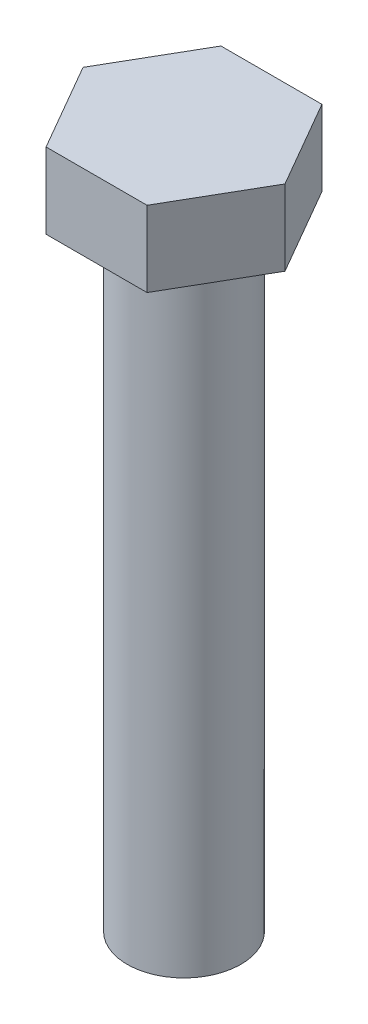
ISO-10303-21;
HEADER;
FILE_DESCRIPTION(('STEP AP214'),'2;1');
FILE_NAME('part.step','',(''),(''),'','','');
FILE_SCHEMA(('AUTOMOTIVE_DESIGN { 1 0 10303 214 1 1 1 1 }'));
ENDSEC;
DATA;
#1=APPLICATION_CONTEXT('core data for automotive mechanical design processes');
#2=APPLICATION_PROTOCOL_DEFINITION('international standard','automotive_design',2000,#1);
#3=PRODUCT_CONTEXT('',#1,'mechanical');
#4=PRODUCT('Part','Part','',(#3));
#5=PRODUCT_RELATED_PRODUCT_CATEGORY('part','',(#4));
#6=PRODUCT_DEFINITION_FORMATION('','',#4);
#7=PRODUCT_DEFINITION_CONTEXT('part definition',#1,'design');
#8=PRODUCT_DEFINITION('design','',#6,#7);
#9=PRODUCT_DEFINITION_SHAPE('','',#8);
#10=(LENGTH_UNIT() NAMED_UNIT(*) SI_UNIT(.MILLI.,.METRE.));
#11=(NAMED_UNIT(*) PLANE_ANGLE_UNIT() SI_UNIT($,.RADIAN.));
#12=(NAMED_UNIT(*) SI_UNIT($,.STERADIAN.) SOLID_ANGLE_UNIT());
#13=UNCERTAINTY_MEASURE_WITH_UNIT(LENGTH_MEASURE(1.E-05),#10,'distance_accuracy_value','');
#14=(GEOMETRIC_REPRESENTATION_CONTEXT(3) GLOBAL_UNCERTAINTY_ASSIGNED_CONTEXT((#13)) GLOBAL_UNIT_ASSIGNED_CONTEXT((#10,
#11,#12)) REPRESENTATION_CONTEXT('',''));
#15=CARTESIAN_POINT('',(0.,0.,0.));
#16=DIRECTION('',(0.,0.,1.));
#17=DIRECTION('',(1.,0.,0.));
#18=AXIS2_PLACEMENT_3D('',#15,#16,#17);
#19=CARTESIAN_POINT('',(4.12077981131412,6.1722,7.13739999999996));
#20=DIRECTION('',(-0.866025403784442,0.,-0.499999999999995));
#21=DIRECTION('',(-0.499999999999995,0.,0.866025403784442));
#22=AXIS2_PLACEMENT_3D('',#19,#20,#21);
#23=PLANE('',#22);
#24=DIRECTION('',(0.499999999999995,0.,-0.866025403784442));
#25=VECTOR('',#24,1.);
#26=CARTESIAN_POINT('',(4.12077981131412,0.,7.13739999999996));
#27=LINE('',#26,#25);
#28=CARTESIAN_POINT('',(4.12077981131412,0.,7.13739999999996));
#29=VERTEX_POINT('',#28);
#30=CARTESIAN_POINT('',(8.24155962262808,0.,0.));
#31=VERTEX_POINT('',#30);
#32=EDGE_CURVE('E123',#29,#31,#27,.T.);
#33=ORIENTED_EDGE('',*,*,#32,.T.);
#34=DIRECTION('',(0.,-1.,0.));
#35=VECTOR('',#34,1.);
#36=CARTESIAN_POINT('',(8.24155962262808,6.1722,0.));
#37=LINE('',#36,#35);
#38=CARTESIAN_POINT('',(8.24155962262808,6.1722,0.));
#39=VERTEX_POINT('',#38);
#40=EDGE_CURVE('E40',#39,#31,#37,.T.);
#41=ORIENTED_EDGE('',*,*,#40,.F.);
#42=DIRECTION('',(0.499999999999995,0.,-0.866025403784442));
#43=VECTOR('',#42,1.);
#44=CARTESIAN_POINT('',(4.12077981131412,6.1722,7.13739999999996));
#45=LINE('',#44,#43);
#46=CARTESIAN_POINT('',(4.12077981131412,6.1722,7.13739999999996));
#47=VERTEX_POINT('',#46);
#48=EDGE_CURVE('E134',#47,#39,#45,.T.);
#49=ORIENTED_EDGE('',*,*,#48,.F.);
#50=DIRECTION('',(0.,-1.,0.));
#51=VECTOR('',#50,1.);
#52=CARTESIAN_POINT('',(4.12077981131412,6.1722,7.13739999999996));
#53=LINE('',#52,#51);
#54=EDGE_CURVE('E119',#47,#29,#53,.T.);
#55=ORIENTED_EDGE('',*,*,#54,.T.);
#56=EDGE_LOOP('',(#33,#41,#49,#55));
#57=FACE_BOUND('',#56,.T.);
#58=ADVANCED_FACE('F37',(#57),#23,.F.);
#59=CARTESIAN_POINT('',(8.24155962262808,6.1722,0.));
#60=DIRECTION('',(-0.866025403784438,0.,0.500000000000001));
#61=DIRECTION('',(0.500000000000001,0.,0.866025403784438));
#62=AXIS2_PLACEMENT_3D('',#59,#60,#61);
#63=PLANE('',#62);
#64=DIRECTION('',(-0.500000000000001,0.,-0.866025403784438));
#65=VECTOR('',#64,1.);
#66=CARTESIAN_POINT('',(8.24155962262808,0.,0.));
#67=LINE('',#66,#65);
#68=CARTESIAN_POINT('',(4.12077981131402,0.,-7.13740000000002));
#69=VERTEX_POINT('',#68);
#70=EDGE_CURVE('E126',#31,#69,#67,.T.);
#71=ORIENTED_EDGE('',*,*,#70,.T.);
#72=DIRECTION('',(0.,-1.,0.));
#73=VECTOR('',#72,1.);
#74=CARTESIAN_POINT('',(4.12077981131402,6.1722,-7.13740000000002));
#75=LINE('',#74,#73);
#76=CARTESIAN_POINT('',(4.12077981131402,6.1722,-7.13740000000002));
#77=VERTEX_POINT('',#76);
#78=EDGE_CURVE('E137',#77,#69,#75,.T.);
#79=ORIENTED_EDGE('',*,*,#78,.F.);
#80=DIRECTION('',(-0.500000000000001,0.,-0.866025403784438));
#81=VECTOR('',#80,1.);
#82=CARTESIAN_POINT('',(8.24155962262808,6.1722,0.));
#83=LINE('',#82,#81);
#84=EDGE_CURVE('E92',#39,#77,#83,.T.);
#85=ORIENTED_EDGE('',*,*,#84,.F.);
#86=ORIENTED_EDGE('',*,*,#40,.T.);
#87=EDGE_LOOP('',(#71,#79,#85,#86));
#88=FACE_BOUND('',#87,.T.);
#89=ADVANCED_FACE('F142',(#88),#63,.F.);
#90=CARTESIAN_POINT('',(4.12077981131402,6.1722,-7.13740000000002));
#91=DIRECTION('',(0.,0.,1.));
#92=DIRECTION('',(1.,0.,0.));
#93=AXIS2_PLACEMENT_3D('',#90,#91,#92);
#94=PLANE('',#93);
#95=DIRECTION('',(-1.,0.,0.));
#96=VECTOR('',#95,1.);
#97=CARTESIAN_POINT('',(4.12077981131402,0.,-7.13740000000002));
#98=LINE('',#97,#96);
#99=CARTESIAN_POINT('',(-4.12077981131407,0.,-7.13739999999999));
#100=VERTEX_POINT('',#99);
#101=EDGE_CURVE('E129',#69,#100,#98,.T.);
#102=ORIENTED_EDGE('',*,*,#101,.T.);
#103=DIRECTION('',(0.,-1.,0.));
#104=VECTOR('',#103,1.);
#105=CARTESIAN_POINT('',(-4.12077981131407,6.1722,-7.13739999999999));
#106=LINE('',#105,#104);
#107=CARTESIAN_POINT('',(-4.12077981131407,6.1722,-7.13739999999999));
#108=VERTEX_POINT('',#107);
#109=EDGE_CURVE('E114',#108,#100,#106,.T.);
#110=ORIENTED_EDGE('',*,*,#109,.F.);
#111=DIRECTION('',(-1.,0.,0.));
#112=VECTOR('',#111,1.);
#113=CARTESIAN_POINT('',(4.12077981131402,6.1722,-7.13740000000002));
#114=LINE('',#113,#112);
#115=EDGE_CURVE('E105',#77,#108,#114,.T.);
#116=ORIENTED_EDGE('',*,*,#115,.F.);
#117=ORIENTED_EDGE('',*,*,#78,.T.);
#118=EDGE_LOOP('',(#102,#110,#116,#117));
#119=FACE_BOUND('',#118,.T.);
#120=ADVANCED_FACE('F148',(#119),#94,.F.);
#121=CARTESIAN_POINT('',(-4.12077981131407,6.1722,-7.13739999999999));
#122=DIRECTION('',(0.866025403784442,0.,0.499999999999995));
#123=DIRECTION('',(0.499999999999995,0.,-0.866025403784442));
#124=AXIS2_PLACEMENT_3D('',#121,#122,#123);
#125=PLANE('',#124);
#126=DIRECTION('',(-0.499999999999995,0.,0.866025403784441));
#127=VECTOR('',#126,1.);
#128=CARTESIAN_POINT('',(-4.12077981131407,0.,-7.13739999999999));
#129=LINE('',#128,#127);
#130=CARTESIAN_POINT('',(-8.24155962262807,0.,0.));
#131=VERTEX_POINT('',#130);
#132=EDGE_CURVE('E113',#100,#131,#129,.T.);
#133=ORIENTED_EDGE('',*,*,#132,.T.);
#134=DIRECTION('',(0.,-1.,0.));
#135=VECTOR('',#134,1.);
#136=CARTESIAN_POINT('',(-8.24155962262807,6.1722,0.));
#137=LINE('',#136,#135);
#138=CARTESIAN_POINT('',(-8.24155962262807,6.1722,0.));
#139=VERTEX_POINT('',#138);
#140=EDGE_CURVE('E110',#139,#131,#137,.T.);
#141=ORIENTED_EDGE('',*,*,#140,.F.);
#142=DIRECTION('',(-0.499999999999995,0.,0.866025403784441));
#143=VECTOR('',#142,1.);
#144=CARTESIAN_POINT('',(-4.12077981131407,6.1722,-7.13739999999999));
#145=LINE('',#144,#143);
#146=EDGE_CURVE('E99',#108,#139,#145,.T.);
#147=ORIENTED_EDGE('',*,*,#146,.F.);
#148=ORIENTED_EDGE('',*,*,#109,.T.);
#149=EDGE_LOOP('',(#133,#141,#147,#148));
#150=FACE_BOUND('',#149,.T.);
#151=ADVANCED_FACE('F111',(#150),#125,.F.);
#152=CARTESIAN_POINT('',(-8.24155962262807,6.1722,0.));
#153=DIRECTION('',(0.866025403784435,0.,-0.500000000000007));
#154=DIRECTION('',(-0.500000000000007,0.,-0.866025403784435));
#155=AXIS2_PLACEMENT_3D('',#152,#153,#154);
#156=PLANE('',#155);
#157=DIRECTION('',(0.500000000000007,0.,0.866025403784435));
#158=VECTOR('',#157,1.);
#159=CARTESIAN_POINT('',(-8.24155962262807,0.,0.));
#160=LINE('',#159,#158);
#161=CARTESIAN_POINT('',(-4.12077981131397,0.,7.13740000000004));
#162=VERTEX_POINT('',#161);
#163=EDGE_CURVE('E77',#131,#162,#160,.T.);
#164=ORIENTED_EDGE('',*,*,#163,.T.);
#165=DIRECTION('',(0.,-1.,0.));
#166=VECTOR('',#165,1.);
#167=CARTESIAN_POINT('',(-4.12077981131397,6.1722,7.13740000000004));
#168=LINE('',#167,#166);
#169=CARTESIAN_POINT('',(-4.12077981131397,6.1722,7.13740000000004));
#170=VERTEX_POINT('',#169);
#171=EDGE_CURVE('E115',#170,#162,#168,.T.);
#172=ORIENTED_EDGE('',*,*,#171,.F.);
#173=DIRECTION('',(0.500000000000007,0.,0.866025403784435));
#174=VECTOR('',#173,1.);
#175=CARTESIAN_POINT('',(-8.24155962262807,6.1722,0.));
#176=LINE('',#175,#174);
#177=EDGE_CURVE('E103',#139,#170,#176,.T.);
#178=ORIENTED_EDGE('',*,*,#177,.F.);
#179=ORIENTED_EDGE('',*,*,#140,.T.);
#180=EDGE_LOOP('',(#164,#172,#178,#179));
#181=FACE_BOUND('',#180,.T.);
#182=ADVANCED_FACE('F117',(#181),#156,.F.);
#183=CARTESIAN_POINT('',(-4.12077981131397,6.1722,7.13740000000004));
#184=DIRECTION('',(0.,0.,-1.));
#185=DIRECTION('',(-1.,0.,0.));
#186=AXIS2_PLACEMENT_3D('',#183,#184,#185);
#187=PLANE('',#186);
#188=DIRECTION('',(1.,0.,0.));
#189=VECTOR('',#188,1.);
#190=CARTESIAN_POINT('',(-4.12077981131397,0.,7.13740000000004));
#191=LINE('',#190,#189);
#192=EDGE_CURVE('E83',#162,#29,#191,.T.);
#193=ORIENTED_EDGE('',*,*,#192,.T.);
#194=ORIENTED_EDGE('',*,*,#54,.F.);
#195=DIRECTION('',(1.,0.,0.));
#196=VECTOR('',#195,1.);
#197=CARTESIAN_POINT('',(-4.12077981131397,6.1722,7.13740000000004));
#198=LINE('',#197,#196);
#199=EDGE_CURVE('E54',#170,#47,#198,.T.);
#200=ORIENTED_EDGE('',*,*,#199,.F.);
#201=ORIENTED_EDGE('',*,*,#171,.T.);
#202=EDGE_LOOP('',(#193,#194,#200,#201));
#203=FACE_BOUND('',#202,.T.);
#204=ADVANCED_FACE('F168',(#203),#187,.F.);
#205=CARTESIAN_POINT('',(0.,6.1722,0.));
#206=DIRECTION('',(0.,1.,0.));
#207=DIRECTION('',(0.,0.,1.));
#208=AXIS2_PLACEMENT_3D('',#205,#206,#207);
#209=PLANE('',#208);
#210=ORIENTED_EDGE('',*,*,#48,.T.);
#211=ORIENTED_EDGE('',*,*,#84,.T.);
#212=ORIENTED_EDGE('',*,*,#115,.T.);
#213=ORIENTED_EDGE('',*,*,#146,.T.);
#214=ORIENTED_EDGE('',*,*,#177,.T.);
#215=ORIENTED_EDGE('',*,*,#199,.T.);
#216=EDGE_LOOP('',(#210,#211,#212,#213,#214,#215));
#217=FACE_BOUND('',#216,.T.);
#218=ADVANCED_FACE('F101',(#217),#209,.T.);
#219=CARTESIAN_POINT('',(0.,0.,0.));
#220=DIRECTION('',(0.,1.,0.));
#221=DIRECTION('',(0.,0.,1.));
#222=AXIS2_PLACEMENT_3D('',#219,#220,#221);
#223=PLANE('',#222);
#224=CARTESIAN_POINT('',(0.,0.,0.));
#225=DIRECTION('',(0.,-1.,0.));
#226=DIRECTION('',(0.,0.,-1.));
#227=AXIS2_PLACEMENT_3D('',#224,#225,#226);
#228=CIRCLE('',#227,4.6437235);
#229=CARTESIAN_POINT('',(0.,0.,-4.6437235));
#230=VERTEX_POINT('',#229);
#231=EDGE_CURVE('E11',#230,#230,#228,.T.);
#232=ORIENTED_EDGE('',*,*,#231,.F.);
#233=EDGE_LOOP('',(#232));
#234=FACE_BOUND('',#233,.T.);
#235=ORIENTED_EDGE('',*,*,#32,.F.);
#236=ORIENTED_EDGE('',*,*,#192,.F.);
#237=ORIENTED_EDGE('',*,*,#163,.F.);
#238=ORIENTED_EDGE('',*,*,#132,.F.);
#239=ORIENTED_EDGE('',*,*,#101,.F.);
#240=ORIENTED_EDGE('',*,*,#70,.F.);
#241=EDGE_LOOP('',(#235,#236,#237,#238,#239,#240));
#242=FACE_BOUND('',#241,.T.);
#243=ADVANCED_FACE('F147',(#234,#242),#223,.F.);
#244=CARTESIAN_POINT('',(0.,-50.8,0.));
#245=DIRECTION('',(0.,1.,0.));
#246=DIRECTION('',(0.,0.,1.));
#247=AXIS2_PLACEMENT_3D('',#244,#245,#246);
#248=CYLINDRICAL_SURFACE('',#247,4.6437235);
#249=CARTESIAN_POINT('',(0.,-50.8,0.));
#250=DIRECTION('',(0.,-1.,0.));
#251=DIRECTION('',(0.,0.,-1.));
#252=AXIS2_PLACEMENT_3D('',#249,#250,#251);
#253=CIRCLE('',#252,4.6437235);
#254=CARTESIAN_POINT('',(0.,-50.8,-4.6437235));
#255=VERTEX_POINT('',#254);
#256=EDGE_CURVE('E127',#255,#255,#253,.T.);
#257=ORIENTED_EDGE('',*,*,#256,.F.);
#258=EDGE_LOOP('',(#257));
#259=FACE_BOUND('',#258,.T.);
#260=ORIENTED_EDGE('',*,*,#231,.T.);
#261=EDGE_LOOP('',(#260));
#262=FACE_BOUND('',#261,.T.);
#263=ADVANCED_FACE('F157',(#259,#262),#248,.T.);
#264=CARTESIAN_POINT('',(0.,-50.8,0.));
#265=DIRECTION('',(0.,-1.,0.));
#266=DIRECTION('',(0.,0.,-1.));
#267=AXIS2_PLACEMENT_3D('',#264,#265,#266);
#268=PLANE('',#267);
#269=ORIENTED_EDGE('',*,*,#256,.T.);
#270=EDGE_LOOP('',(#269));
#271=FACE_BOUND('',#270,.T.);
#272=ADVANCED_FACE('F155',(#271),#268,.T.);
#273=CLOSED_SHELL('',(#58,#89,#120,#151,#182,#204,#218,#243,#263,#272));
#274=MANIFOLD_SOLID_BREP('B2',#273);
#275=ADVANCED_BREP_SHAPE_REPRESENTATION('',(#18,#274),#14);
#276=SHAPE_DEFINITION_REPRESENTATION(#9,#275);
ENDSEC;
END-ISO-10303-21;
